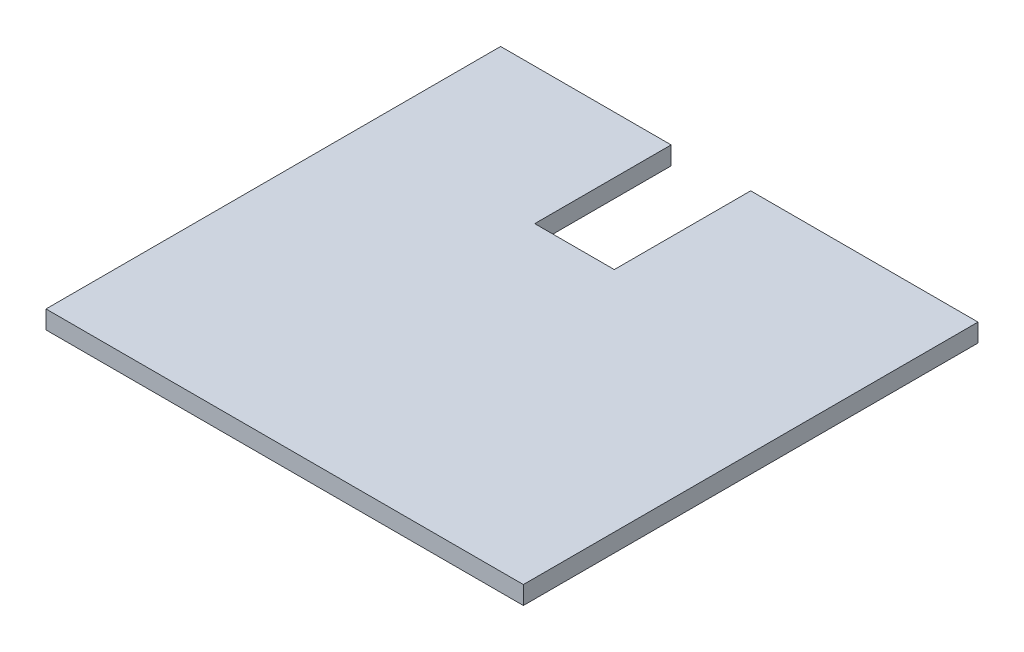
ISO-10303-21;
HEADER;
FILE_DESCRIPTION(('STEP AP214'),'2;1');
FILE_NAME('part.step','',(''),(''),'','','');
FILE_SCHEMA(('AUTOMOTIVE_DESIGN { 1 0 10303 214 1 1 1 1 }'));
ENDSEC;
DATA;
#1=APPLICATION_CONTEXT('core data for automotive mechanical design processes');
#2=APPLICATION_PROTOCOL_DEFINITION('international standard','automotive_design',2000,#1);
#3=PRODUCT_CONTEXT('',#1,'mechanical');
#4=PRODUCT('Part','Part','',(#3));
#5=PRODUCT_RELATED_PRODUCT_CATEGORY('part','',(#4));
#6=PRODUCT_DEFINITION_FORMATION('','',#4);
#7=PRODUCT_DEFINITION_CONTEXT('part definition',#1,'design');
#8=PRODUCT_DEFINITION('design','',#6,#7);
#9=PRODUCT_DEFINITION_SHAPE('','',#8);
#10=(LENGTH_UNIT() NAMED_UNIT(*) SI_UNIT(.MILLI.,.METRE.));
#11=(NAMED_UNIT(*) PLANE_ANGLE_UNIT() SI_UNIT($,.RADIAN.));
#12=(NAMED_UNIT(*) SI_UNIT($,.STERADIAN.) SOLID_ANGLE_UNIT());
#13=UNCERTAINTY_MEASURE_WITH_UNIT(LENGTH_MEASURE(1.E-05),#10,'distance_accuracy_value','');
#14=(GEOMETRIC_REPRESENTATION_CONTEXT(3) GLOBAL_UNCERTAINTY_ASSIGNED_CONTEXT((#13)) GLOBAL_UNIT_ASSIGNED_CONTEXT((#10,
#11,#12)) REPRESENTATION_CONTEXT('',''));
#15=CARTESIAN_POINT('',(0.,0.,0.));
#16=DIRECTION('',(0.,0.,1.));
#17=DIRECTION('',(1.,0.,0.));
#18=AXIS2_PLACEMENT_3D('',#15,#16,#17);
#19=CARTESIAN_POINT('',(-9.12621359223301,0.8,11.6990291262136));
#20=DIRECTION('',(1.,0.,0.));
#21=DIRECTION('',(0.,0.,-1.));
#22=AXIS2_PLACEMENT_3D('',#19,#20,#21);
#23=PLANE('',#22);
#24=DIRECTION('',(0.,0.,1.));
#25=VECTOR('',#24,1.);
#26=CARTESIAN_POINT('',(-9.12621359223301,0.,11.6990291262136));
#27=LINE('',#26,#25);
#28=CARTESIAN_POINT('',(-9.12621359223301,0.,-8.3009708737864));
#29=VERTEX_POINT('',#28);
#30=CARTESIAN_POINT('',(-9.12621359223301,0.,11.6990291262136));
#31=VERTEX_POINT('',#30);
#32=EDGE_CURVE('E129',#29,#31,#27,.T.);
#33=ORIENTED_EDGE('',*,*,#32,.T.);
#34=DIRECTION('',(0.,-1.,0.));
#35=VECTOR('',#34,1.);
#36=CARTESIAN_POINT('',(-9.12621359223301,0.8,11.6990291262136));
#37=LINE('',#36,#35);
#38=CARTESIAN_POINT('',(-9.12621359223301,0.8,11.6990291262136));
#39=VERTEX_POINT('',#38);
#40=EDGE_CURVE('E11',#39,#31,#37,.T.);
#41=ORIENTED_EDGE('',*,*,#40,.F.);
#42=DIRECTION('',(0.,0.,1.));
#43=VECTOR('',#42,1.);
#44=CARTESIAN_POINT('',(-9.12621359223301,0.8,11.6990291262136));
#45=LINE('',#44,#43);
#46=CARTESIAN_POINT('',(-9.12621359223301,0.8,-8.3009708737864));
#47=VERTEX_POINT('',#46);
#48=EDGE_CURVE('E143',#47,#39,#45,.T.);
#49=ORIENTED_EDGE('',*,*,#48,.F.);
#50=DIRECTION('',(0.,-1.,0.));
#51=VECTOR('',#50,1.);
#52=CARTESIAN_POINT('',(-9.12621359223301,0.8,-8.3009708737864));
#53=LINE('',#52,#51);
#54=EDGE_CURVE('E125',#47,#29,#53,.T.);
#55=ORIENTED_EDGE('',*,*,#54,.T.);
#56=EDGE_LOOP('',(#33,#41,#49,#55));
#57=FACE_BOUND('',#56,.T.);
#58=ADVANCED_FACE('F33',(#57),#23,.F.);
#59=CARTESIAN_POINT('',(11.873786407767,0.8,11.6990291262136));
#60=DIRECTION('',(0.,0.,-1.));
#61=DIRECTION('',(-1.,0.,0.));
#62=AXIS2_PLACEMENT_3D('',#59,#60,#61);
#63=PLANE('',#62);
#64=DIRECTION('',(1.,0.,0.));
#65=VECTOR('',#64,1.);
#66=CARTESIAN_POINT('',(11.873786407767,0.,11.6990291262136));
#67=LINE('',#66,#65);
#68=CARTESIAN_POINT('',(11.873786407767,0.,11.6990291262136));
#69=VERTEX_POINT('',#68);
#70=EDGE_CURVE('E132',#31,#69,#67,.T.);
#71=ORIENTED_EDGE('',*,*,#70,.T.);
#72=DIRECTION('',(0.,-1.,0.));
#73=VECTOR('',#72,1.);
#74=CARTESIAN_POINT('',(11.873786407767,0.8,11.6990291262136));
#75=LINE('',#74,#73);
#76=CARTESIAN_POINT('',(11.873786407767,0.8,11.6990291262136));
#77=VERTEX_POINT('',#76);
#78=EDGE_CURVE('E41',#77,#69,#75,.T.);
#79=ORIENTED_EDGE('',*,*,#78,.F.);
#80=DIRECTION('',(1.,0.,0.));
#81=VECTOR('',#80,1.);
#82=CARTESIAN_POINT('',(11.873786407767,0.8,11.6990291262136));
#83=LINE('',#82,#81);
#84=EDGE_CURVE('E92',#39,#77,#83,.T.);
#85=ORIENTED_EDGE('',*,*,#84,.F.);
#86=ORIENTED_EDGE('',*,*,#40,.T.);
#87=EDGE_LOOP('',(#71,#79,#85,#86));
#88=FACE_BOUND('',#87,.T.);
#89=ADVANCED_FACE('F178',(#88),#63,.F.);
#90=CARTESIAN_POINT('',(11.873786407767,0.8,-8.30097087378641));
#91=DIRECTION('',(-1.,0.,0.));
#92=DIRECTION('',(0.,0.,1.));
#93=AXIS2_PLACEMENT_3D('',#90,#91,#92);
#94=PLANE('',#93);
#95=DIRECTION('',(0.,0.,-1.));
#96=VECTOR('',#95,1.);
#97=CARTESIAN_POINT('',(11.873786407767,0.,-8.30097087378641));
#98=LINE('',#97,#96);
#99=CARTESIAN_POINT('',(11.873786407767,0.,-8.30097087378641));
#100=VERTEX_POINT('',#99);
#101=EDGE_CURVE('E134',#69,#100,#98,.T.);
#102=ORIENTED_EDGE('',*,*,#101,.T.);
#103=DIRECTION('',(0.,-1.,0.));
#104=VECTOR('',#103,1.);
#105=CARTESIAN_POINT('',(11.873786407767,0.8,-8.30097087378641));
#106=LINE('',#105,#104);
#107=CARTESIAN_POINT('',(11.873786407767,0.8,-8.30097087378641));
#108=VERTEX_POINT('',#107);
#109=EDGE_CURVE('E150',#108,#100,#106,.T.);
#110=ORIENTED_EDGE('',*,*,#109,.F.);
#111=DIRECTION('',(0.,0.,-1.));
#112=VECTOR('',#111,1.);
#113=CARTESIAN_POINT('',(11.873786407767,0.8,-8.30097087378641));
#114=LINE('',#113,#112);
#115=EDGE_CURVE('E158',#77,#108,#114,.T.);
#116=ORIENTED_EDGE('',*,*,#115,.F.);
#117=ORIENTED_EDGE('',*,*,#78,.T.);
#118=EDGE_LOOP('',(#102,#110,#116,#117));
#119=FACE_BOUND('',#118,.T.);
#120=ADVANCED_FACE('F156',(#119),#94,.F.);
#121=CARTESIAN_POINT('',(1.87378640776699,0.8,-8.30097087378641));
#122=DIRECTION('',(0.,0.,1.));
#123=DIRECTION('',(1.,0.,0.));
#124=AXIS2_PLACEMENT_3D('',#121,#122,#123);
#125=PLANE('',#124);
#126=DIRECTION('',(-1.,0.,0.));
#127=VECTOR('',#126,1.);
#128=CARTESIAN_POINT('',(1.87378640776699,0.,-8.30097087378641));
#129=LINE('',#128,#127);
#130=CARTESIAN_POINT('',(1.87378640776699,0.,-8.30097087378641));
#131=VERTEX_POINT('',#130);
#132=EDGE_CURVE('E136',#100,#131,#129,.T.);
#133=ORIENTED_EDGE('',*,*,#132,.T.);
#134=DIRECTION('',(0.,-1.,0.));
#135=VECTOR('',#134,1.);
#136=CARTESIAN_POINT('',(1.87378640776699,0.8,-8.30097087378641));
#137=LINE('',#136,#135);
#138=CARTESIAN_POINT('',(1.87378640776699,0.8,-8.30097087378641));
#139=VERTEX_POINT('',#138);
#140=EDGE_CURVE('E147',#139,#131,#137,.T.);
#141=ORIENTED_EDGE('',*,*,#140,.F.);
#142=DIRECTION('',(-1.,0.,0.));
#143=VECTOR('',#142,1.);
#144=CARTESIAN_POINT('',(1.87378640776699,0.8,-8.30097087378641));
#145=LINE('',#144,#143);
#146=EDGE_CURVE('E170',#108,#139,#145,.T.);
#147=ORIENTED_EDGE('',*,*,#146,.F.);
#148=ORIENTED_EDGE('',*,*,#109,.T.);
#149=EDGE_LOOP('',(#133,#141,#147,#148));
#150=FACE_BOUND('',#149,.T.);
#151=ADVANCED_FACE('F166',(#150),#125,.F.);
#152=CARTESIAN_POINT('',(1.87378640776699,0.8,-2.3009708737864));
#153=DIRECTION('',(1.,0.,0.));
#154=DIRECTION('',(0.,0.,-1.));
#155=AXIS2_PLACEMENT_3D('',#152,#153,#154);
#156=PLANE('',#155);
#157=DIRECTION('',(0.,0.,1.));
#158=VECTOR('',#157,1.);
#159=CARTESIAN_POINT('',(1.87378640776699,0.,-2.3009708737864));
#160=LINE('',#159,#158);
#161=CARTESIAN_POINT('',(1.87378640776699,0.,-2.3009708737864));
#162=VERTEX_POINT('',#161);
#163=EDGE_CURVE('E138',#131,#162,#160,.T.);
#164=ORIENTED_EDGE('',*,*,#163,.T.);
#165=DIRECTION('',(0.,-1.,0.));
#166=VECTOR('',#165,1.);
#167=CARTESIAN_POINT('',(1.87378640776699,0.8,-2.3009708737864));
#168=LINE('',#167,#166);
#169=CARTESIAN_POINT('',(1.87378640776699,0.8,-2.3009708737864));
#170=VERTEX_POINT('',#169);
#171=EDGE_CURVE('E120',#170,#162,#168,.T.);
#172=ORIENTED_EDGE('',*,*,#171,.F.);
#173=DIRECTION('',(0.,0.,1.));
#174=VECTOR('',#173,1.);
#175=CARTESIAN_POINT('',(1.87378640776699,0.8,-2.3009708737864));
#176=LINE('',#175,#174);
#177=EDGE_CURVE('E111',#139,#170,#176,.T.);
#178=ORIENTED_EDGE('',*,*,#177,.F.);
#179=ORIENTED_EDGE('',*,*,#140,.T.);
#180=EDGE_LOOP('',(#164,#172,#178,#179));
#181=FACE_BOUND('',#180,.T.);
#182=ADVANCED_FACE('F169',(#181),#156,.F.);
#183=CARTESIAN_POINT('',(-1.62621359223301,0.8,-2.3009708737864));
#184=DIRECTION('',(0.,0.,1.));
#185=DIRECTION('',(1.,0.,0.));
#186=AXIS2_PLACEMENT_3D('',#183,#184,#185);
#187=PLANE('',#186);
#188=DIRECTION('',(-1.,0.,0.));
#189=VECTOR('',#188,1.);
#190=CARTESIAN_POINT('',(-1.62621359223301,0.,-2.3009708737864));
#191=LINE('',#190,#189);
#192=CARTESIAN_POINT('',(-1.62621359223301,0.,-2.3009708737864));
#193=VERTEX_POINT('',#192);
#194=EDGE_CURVE('E119',#162,#193,#191,.T.);
#195=ORIENTED_EDGE('',*,*,#194,.T.);
#196=DIRECTION('',(0.,-1.,0.));
#197=VECTOR('',#196,1.);
#198=CARTESIAN_POINT('',(-1.62621359223301,0.8,-2.3009708737864));
#199=LINE('',#198,#197);
#200=CARTESIAN_POINT('',(-1.62621359223301,0.8,-2.3009708737864));
#201=VERTEX_POINT('',#200);
#202=EDGE_CURVE('E116',#201,#193,#199,.T.);
#203=ORIENTED_EDGE('',*,*,#202,.F.);
#204=DIRECTION('',(-1.,0.,0.));
#205=VECTOR('',#204,1.);
#206=CARTESIAN_POINT('',(-1.62621359223301,0.8,-2.3009708737864));
#207=LINE('',#206,#205);
#208=EDGE_CURVE('E105',#170,#201,#207,.T.);
#209=ORIENTED_EDGE('',*,*,#208,.F.);
#210=ORIENTED_EDGE('',*,*,#171,.T.);
#211=EDGE_LOOP('',(#195,#203,#209,#210));
#212=FACE_BOUND('',#211,.T.);
#213=ADVANCED_FACE('F117',(#212),#187,.F.);
#214=CARTESIAN_POINT('',(-1.62621359223301,0.8,-8.3009708737864));
#215=DIRECTION('',(-1.,0.,0.));
#216=DIRECTION('',(0.,0.,1.));
#217=AXIS2_PLACEMENT_3D('',#214,#215,#216);
#218=PLANE('',#217);
#219=DIRECTION('',(0.,0.,-1.));
#220=VECTOR('',#219,1.);
#221=CARTESIAN_POINT('',(-1.62621359223301,0.,-8.3009708737864));
#222=LINE('',#221,#220);
#223=CARTESIAN_POINT('',(-1.62621359223301,0.,-8.3009708737864));
#224=VERTEX_POINT('',#223);
#225=EDGE_CURVE('E78',#193,#224,#222,.T.);
#226=ORIENTED_EDGE('',*,*,#225,.T.);
#227=DIRECTION('',(0.,-1.,0.));
#228=VECTOR('',#227,1.);
#229=CARTESIAN_POINT('',(-1.62621359223301,0.8,-8.3009708737864));
#230=LINE('',#229,#228);
#231=CARTESIAN_POINT('',(-1.62621359223301,0.8,-8.3009708737864));
#232=VERTEX_POINT('',#231);
#233=EDGE_CURVE('E121',#232,#224,#230,.T.);
#234=ORIENTED_EDGE('',*,*,#233,.F.);
#235=DIRECTION('',(0.,0.,-1.));
#236=VECTOR('',#235,1.);
#237=CARTESIAN_POINT('',(-1.62621359223301,0.8,-8.3009708737864));
#238=LINE('',#237,#236);
#239=EDGE_CURVE('E109',#201,#232,#238,.T.);
#240=ORIENTED_EDGE('',*,*,#239,.F.);
#241=ORIENTED_EDGE('',*,*,#202,.T.);
#242=EDGE_LOOP('',(#226,#234,#240,#241));
#243=FACE_BOUND('',#242,.T.);
#244=ADVANCED_FACE('F123',(#243),#218,.F.);
#245=CARTESIAN_POINT('',(-9.12621359223301,0.8,-8.3009708737864));
#246=DIRECTION('',(0.,0.,1.));
#247=DIRECTION('',(1.,0.,0.));
#248=AXIS2_PLACEMENT_3D('',#245,#246,#247);
#249=PLANE('',#248);
#250=DIRECTION('',(-1.,0.,0.));
#251=VECTOR('',#250,1.);
#252=CARTESIAN_POINT('',(-9.12621359223301,0.,-8.3009708737864));
#253=LINE('',#252,#251);
#254=EDGE_CURVE('E84',#224,#29,#253,.T.);
#255=ORIENTED_EDGE('',*,*,#254,.T.);
#256=ORIENTED_EDGE('',*,*,#54,.F.);
#257=DIRECTION('',(-1.,0.,0.));
#258=VECTOR('',#257,1.);
#259=CARTESIAN_POINT('',(-9.12621359223301,0.8,-8.3009708737864));
#260=LINE('',#259,#258);
#261=EDGE_CURVE('E49',#232,#47,#260,.T.);
#262=ORIENTED_EDGE('',*,*,#261,.F.);
#263=ORIENTED_EDGE('',*,*,#233,.T.);
#264=EDGE_LOOP('',(#255,#256,#262,#263));
#265=FACE_BOUND('',#264,.T.);
#266=ADVANCED_FACE('F194',(#265),#249,.F.);
#267=CARTESIAN_POINT('',(0.,0.8,0.));
#268=DIRECTION('',(0.,-1.,0.));
#269=DIRECTION('',(0.,0.,-1.));
#270=AXIS2_PLACEMENT_3D('',#267,#268,#269);
#271=PLANE('',#270);
#272=ORIENTED_EDGE('',*,*,#48,.T.);
#273=ORIENTED_EDGE('',*,*,#84,.T.);
#274=ORIENTED_EDGE('',*,*,#115,.T.);
#275=ORIENTED_EDGE('',*,*,#146,.T.);
#276=ORIENTED_EDGE('',*,*,#177,.T.);
#277=ORIENTED_EDGE('',*,*,#208,.T.);
#278=ORIENTED_EDGE('',*,*,#239,.T.);
#279=ORIENTED_EDGE('',*,*,#261,.T.);
#280=EDGE_LOOP('',(#272,#273,#274,#275,#276,#277,#278,#279));
#281=FACE_BOUND('',#280,.T.);
#282=ADVANCED_FACE('F107',(#281),#271,.F.);
#283=CARTESIAN_POINT('',(0.,0.,0.));
#284=DIRECTION('',(0.,-1.,0.));
#285=DIRECTION('',(0.,0.,-1.));
#286=AXIS2_PLACEMENT_3D('',#283,#284,#285);
#287=PLANE('',#286);
#288=ORIENTED_EDGE('',*,*,#32,.F.);
#289=ORIENTED_EDGE('',*,*,#254,.F.);
#290=ORIENTED_EDGE('',*,*,#225,.F.);
#291=ORIENTED_EDGE('',*,*,#194,.F.);
#292=ORIENTED_EDGE('',*,*,#163,.F.);
#293=ORIENTED_EDGE('',*,*,#132,.F.);
#294=ORIENTED_EDGE('',*,*,#101,.F.);
#295=ORIENTED_EDGE('',*,*,#70,.F.);
#296=EDGE_LOOP('',(#288,#289,#290,#291,#292,#293,#294,#295));
#297=FACE_BOUND('',#296,.T.);
#298=ADVANCED_FACE('F162',(#297),#287,.T.);
#299=CLOSED_SHELL('',(#58,#89,#120,#151,#182,#213,#244,#266,#282,#298));
#300=MANIFOLD_SOLID_BREP('B2',#299);
#301=ADVANCED_BREP_SHAPE_REPRESENTATION('',(#18,#300),#14);
#302=SHAPE_DEFINITION_REPRESENTATION(#9,#301);
ENDSEC;
END-ISO-10303-21;
